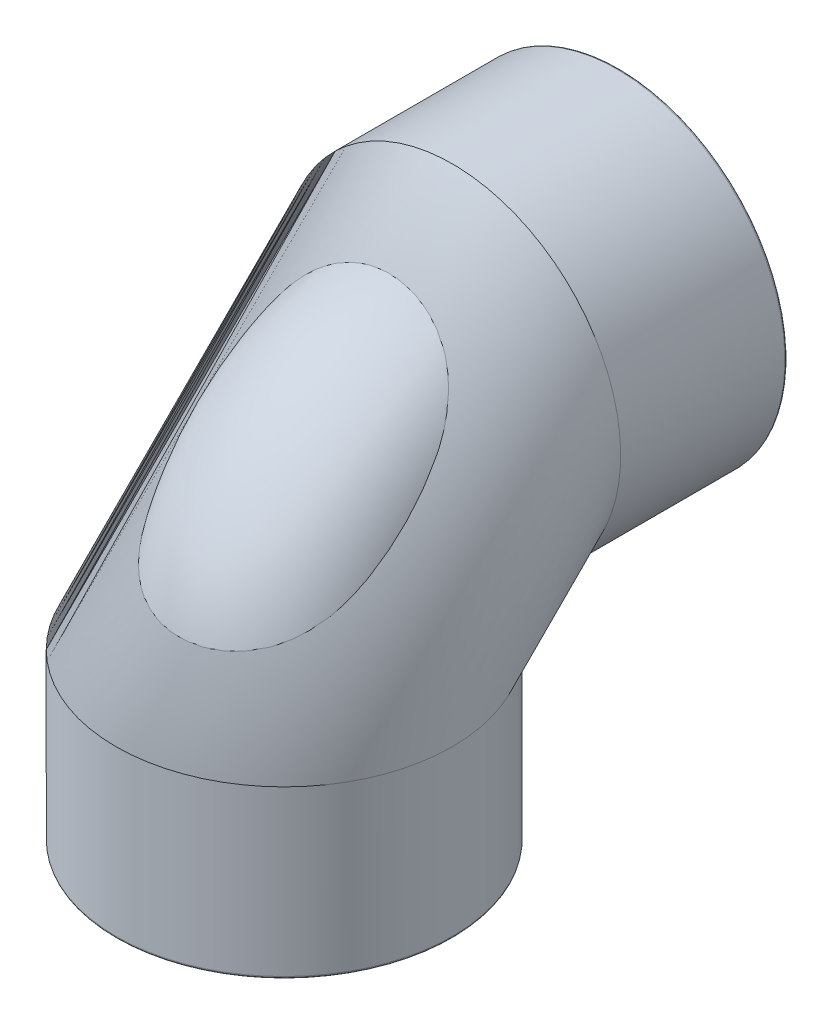
ISO-10303-21;
HEADER;
FILE_DESCRIPTION(('STEP AP214'),'2;1');
FILE_NAME('part.step','',(''),(''),'','','');
FILE_SCHEMA(('AUTOMOTIVE_DESIGN { 1 0 10303 214 1 1 1 1 }'));
ENDSEC;
DATA;
#1=APPLICATION_CONTEXT('core data for automotive mechanical design processes');
#2=APPLICATION_PROTOCOL_DEFINITION('international standard','automotive_design',2000,#1);
#3=PRODUCT_CONTEXT('',#1,'mechanical');
#4=PRODUCT('Part','Part','',(#3));
#5=PRODUCT_RELATED_PRODUCT_CATEGORY('part','',(#4));
#6=PRODUCT_DEFINITION_FORMATION('','',#4);
#7=PRODUCT_DEFINITION_CONTEXT('part definition',#1,'design');
#8=PRODUCT_DEFINITION('design','',#6,#7);
#9=PRODUCT_DEFINITION_SHAPE('','',#8);
#10=(LENGTH_UNIT() NAMED_UNIT(*) SI_UNIT(.MILLI.,.METRE.));
#11=(NAMED_UNIT(*) PLANE_ANGLE_UNIT() SI_UNIT($,.RADIAN.));
#12=(NAMED_UNIT(*) SI_UNIT($,.STERADIAN.) SOLID_ANGLE_UNIT());
#13=UNCERTAINTY_MEASURE_WITH_UNIT(LENGTH_MEASURE(1.E-05),#10,'distance_accuracy_value','');
#14=(GEOMETRIC_REPRESENTATION_CONTEXT(3) GLOBAL_UNCERTAINTY_ASSIGNED_CONTEXT((#13)) GLOBAL_UNIT_ASSIGNED_CONTEXT((#10,
#11,#12)) REPRESENTATION_CONTEXT('',''));
#15=CARTESIAN_POINT('',(0.,0.,0.));
#16=DIRECTION('',(0.,0.,1.));
#17=DIRECTION('',(1.,0.,0.));
#18=AXIS2_PLACEMENT_3D('',#15,#16,#17);
#19=CARTESIAN_POINT('',(0.,16.98625,-17.145));
#20=DIRECTION('',(-1.,0.,0.));
#21=DIRECTION('',(0.,0.,1.));
#22=AXIS2_PLACEMENT_3D('',#19,#20,#21);
#23=TOROIDAL_SURFACE('',#22,17.145,11.43);
#24=CARTESIAN_POINT('',(-7.45883023165069,24.9746838183603,-14.2875));
#25=CARTESIAN_POINT('',(-7.71480966111787,25.208812781819,-14.2875));
#26=CARTESIAN_POINT('',(-7.96089992627123,25.4537254122893,-14.2875));
#27=CARTESIAN_POINT('',(-8.43172250249195,25.9634593007728,-14.2875));
#28=CARTESIAN_POINT('',(-8.65644718191378,26.228287612492,-14.2875));
#29=CARTESIAN_POINT('',(-9.0830868593863,26.7763336796114,-14.2875));
#30=CARTESIAN_POINT('',(-9.28496867167002,27.0595772718441,-14.2875));
#31=CARTESIAN_POINT('',(-9.66397833373367,27.6421671954127,-14.2875));
#32=CARTESIAN_POINT('',(-9.84110666933505,27.9415132105563,-14.2875));
#33=CARTESIAN_POINT('',(-10.1687216120955,28.5534205121965,-14.2875));
#34=CARTESIAN_POINT('',(-10.3192781943923,28.8659443196865,-14.2875));
#35=CARTESIAN_POINT('',(-10.5930403915046,29.5027661150353,-14.2875));
#36=CARTESIAN_POINT('',(-10.7162453475049,29.8270643862854,-14.2875));
#37=CARTESIAN_POINT('',(-10.9341339115931,30.4849406084451,-14.2875));
#38=CARTESIAN_POINT('',(-11.0288309336531,30.8185141140679,-14.2875));
#39=CARTESIAN_POINT('',(-11.1888700450618,31.4926293715641,-14.2875));
#40=CARTESIAN_POINT('',(-11.2542128984137,31.8331709418377,-14.2875));
#41=CARTESIAN_POINT('',(-11.3536982676776,32.5107499884751,-14.2875));
#42=CARTESIAN_POINT('',(-11.3885261050358,32.8476869266677,-14.2875));
#43=CARTESIAN_POINT('',(-11.4290955630821,33.5233103918663,-14.2875));
#44=CARTESIAN_POINT('',(-11.4348375150483,33.8619968989014,-14.2875));
#45=CARTESIAN_POINT('',(-11.4170434075574,34.538597996359,-14.2875));
#46=CARTESIAN_POINT('',(-11.3935077643061,34.8765125976864,-14.2875));
#47=CARTESIAN_POINT('',(-11.3172016789524,35.5490255828601,-14.2875));
#48=CARTESIAN_POINT('',(-11.2644316962163,35.8836240187299,-14.2875));
#49=CARTESIAN_POINT('',(-11.1315370927082,36.5390774695893,-14.2875));
#50=CARTESIAN_POINT('',(-11.052091102539,36.8600702143011,-14.2875));
#51=CARTESIAN_POINT('',(-10.866088627293,37.4941022173594,-14.2875));
#52=CARTESIAN_POINT('',(-10.7595325690276,37.8071416008355,-14.2875));
#53=CARTESIAN_POINT('',(-10.5200168613575,38.4229230612669,-14.2875));
#54=CARTESIAN_POINT('',(-10.3870593554699,38.7256659718506,-14.2875));
#55=CARTESIAN_POINT('',(-10.095643538704,39.3186203313031,-14.2875));
#56=CARTESIAN_POINT('',(-9.93718542521087,39.6088318771479,-14.2875));
#57=CARTESIAN_POINT('',(-9.59851589753956,40.1701787613803,-14.2875));
#58=CARTESIAN_POINT('',(-9.41867749789791,40.4415392118104,-14.2875));
#59=CARTESIAN_POINT('',(-9.03661057550381,40.9680106499709,-14.2875));
#60=CARTESIAN_POINT('',(-8.83438229457443,41.2231218131558,-14.2875));
#61=CARTESIAN_POINT('',(-8.40896785057139,41.715209540656,-14.2875));
#62=CARTESIAN_POINT('',(-8.18578252882152,41.952186832266,-14.2875));
#63=CARTESIAN_POINT('',(-7.72003570034665,42.4062685474678,-14.2875));
#64=CARTESIAN_POINT('',(-7.47747427203375,42.6233730514742,-14.2875));
#65=CARTESIAN_POINT('',(-6.97701542710598,43.0342145211707,-14.2875));
#66=CARTESIAN_POINT('',(-6.71927836378393,43.2281468497279,-14.2875));
#67=CARTESIAN_POINT('',(-6.18831946313874,43.5935075203781,-14.2875));
#68=CARTESIAN_POINT('',(-5.91509772692646,43.764936009391,-14.2875));
#69=CARTESIAN_POINT('',(-5.35512309162894,44.0840333013399,-14.2875));
#70=CARTESIAN_POINT('',(-5.06837050233624,44.231702647907,-14.2875));
#71=CARTESIAN_POINT('',(-4.48338061663701,44.5022054368786,-14.2875));
#72=CARTESIAN_POINT('',(-4.18514334373327,44.6250389301051,-14.2875));
#73=CARTESIAN_POINT('',(-3.58086720981553,44.8444101236301,-14.2875));
#74=CARTESIAN_POINT('',(-3.27487572966313,44.9410783577361,-14.2875));
#75=CARTESIAN_POINT('',(-2.65582470105409,45.1082375774968,-14.2875));
#76=CARTESIAN_POINT('',(-2.3427651791848,45.1787286616029,-14.2875));
#77=CARTESIAN_POINT('',(-1.71181565375761,45.2930205453575,-14.2875));
#78=CARTESIAN_POINT('',(-1.39392571403858,45.3368216974267,-14.2875));
#79=CARTESIAN_POINT('',(-0.755582021134107,45.3974165510231,-14.2875));
#80=CARTESIAN_POINT('',(-0.435128269706446,45.4142102710654,-14.2875));
#81=CARTESIAN_POINT('',(0.205305613471225,45.4206606630631,-14.2875));
#82=CARTESIAN_POINT('',(0.525285111829833,45.4103803991724,-14.2875));
#83=CARTESIAN_POINT('',(1.16323902370062,45.3628910870351,-14.2875));
#84=CARTESIAN_POINT('',(1.48121344112481,45.3256820913442,-14.2875));
#85=CARTESIAN_POINT('',(2.11289456939969,45.2246050667367,-14.2875));
#86=CARTESIAN_POINT('',(2.4266013023133,45.1607371756943,-14.2875));
#87=CARTESIAN_POINT('',(3.04752019389867,45.006804624708,-14.2875));
#88=CARTESIAN_POINT('',(3.35473234948074,44.9167399523015,-14.2875));
#89=CARTESIAN_POINT('',(3.96043879778431,44.7110801504198,-14.2875));
#90=CARTESIAN_POINT('',(4.25893434515104,44.5954887159114,-14.2875));
#91=CARTESIAN_POINT('',(4.8451415701518,44.3396028927693,-14.2875));
#92=CARTESIAN_POINT('',(5.13285325453304,44.1993085195921,-14.2875));
#93=CARTESIAN_POINT('',(5.69546305621696,43.8950286448159,-14.2875));
#94=CARTESIAN_POINT('',(5.97036116964031,43.7310431360445,-14.2875));
#95=CARTESIAN_POINT('',(6.50541166137431,43.3805617106751,-14.2875));
#96=CARTESIAN_POINT('',(6.76556401444017,43.1940657555408,-14.2875));
#97=CARTESIAN_POINT('',(7.26980467173614,42.7995106793956,-14.2875));
#98=CARTESIAN_POINT('',(7.51385994712915,42.591409348299,-14.2875));
#99=CARTESIAN_POINT('',(7.98363411364638,42.1554496163827,-14.2875));
#100=CARTESIAN_POINT('',(8.20935299462803,41.9275912046348,-14.2875));
#101=CARTESIAN_POINT('',(8.64089216569168,41.4537501908955,-14.2875));
#102=CARTESIAN_POINT('',(8.84671229827925,41.2077674454808,-14.2875));
#103=CARTESIAN_POINT('',(9.23704002365344,40.6994377317327,-14.2875));
#104=CARTESIAN_POINT('',(9.42154754612238,40.4370907094122,-14.2875));
#105=CARTESIAN_POINT('',(9.76879472189519,39.8966627270961,-14.2875));
#106=CARTESIAN_POINT('',(9.9314306399601,39.618515113255,-14.2875));
#107=CARTESIAN_POINT('',(10.2328384588025,39.0495791869852,-14.2875));
#108=CARTESIAN_POINT('',(10.371610314724,38.7587908507976,-14.2875));
#109=CARTESIAN_POINT('',(10.6243805480562,38.1666374662274,-14.2875));
#110=CARTESIAN_POINT('',(10.7383786679564,37.8652723079418,-14.2875));
#111=CARTESIAN_POINT('',(10.9408777510648,37.2540953978092,-14.2875));
#112=CARTESIAN_POINT('',(11.0293785725126,36.944283599011,-14.2875));
#113=CARTESIAN_POINT('',(11.180976621597,36.3157984703174,-14.2875));
#114=CARTESIAN_POINT('',(11.243858106505,35.9970730998945,-14.2875));
#115=CARTESIAN_POINT('',(11.3428206700971,35.3554910254377,-14.2875));
#116=CARTESIAN_POINT('',(11.3789016476555,35.0326343058199,-14.2875));
#117=CARTESIAN_POINT('',(11.4241252207966,34.3850297839462,-14.2875));
#118=CARTESIAN_POINT('',(11.4332667644331,34.0602819083395,-14.2875));
#119=CARTESIAN_POINT('',(11.4246707102259,33.4111440236924,-14.2875));
#120=CARTESIAN_POINT('',(11.40693287151,33.086754017885,-14.2875));
#121=CARTESIAN_POINT('',(11.3444062385706,32.4360685386122,-14.2875));
#122=CARTESIAN_POINT('',(11.2992471638087,32.1098086408711,-14.2875));
#123=CARTESIAN_POINT('',(11.1820344918799,31.4621598701224,-14.2875));
#124=CARTESIAN_POINT('',(11.1099807053693,31.1407710314245,-14.2875));
#125=CARTESIAN_POINT('',(10.9396341650393,30.5050175096588,-14.2875));
#126=CARTESIAN_POINT('',(10.8413405968599,30.1906530449229,-14.2875));
#127=CARTESIAN_POINT('',(10.6193501172482,29.5710277493251,-14.2875));
#128=CARTESIAN_POINT('',(10.4956528588836,29.2657670428563,-14.2875));
#129=CARTESIAN_POINT('',(10.2209251226748,28.6598704078024,-14.2875));
#130=CARTESIAN_POINT('',(10.069364292786,28.3594749113808,-14.2875));
#131=CARTESIAN_POINT('',(9.74198110672175,27.7722118576001,-14.2875));
#132=CARTESIAN_POINT('',(9.56615841268171,27.4853444887049,-14.2875));
#133=CARTESIAN_POINT('',(9.19158540373032,26.9269875167978,-14.2875));
#134=CARTESIAN_POINT('',(8.99283469121879,26.6554981805818,-14.2875));
#135=CARTESIAN_POINT('',(8.573772191267,26.1295543740255,-14.2875));
#136=CARTESIAN_POINT('',(8.35345285930125,25.8751059172349,-14.2875));
#137=CARTESIAN_POINT('',(7.88690643538205,25.3787149724366,-14.2875));
#138=CARTESIAN_POINT('',(7.64015993023102,25.1372603763293,-14.2875));
#139=CARTESIAN_POINT('',(7.12729563067288,24.6758518668723,-14.2875));
#140=CARTESIAN_POINT('',(6.86117679188557,24.4558991142065,-14.2875));
#141=CARTESIAN_POINT('',(6.31109445603938,24.0391192676701,-14.2875));
#142=CARTESIAN_POINT('',(6.02711837504624,23.8423087688156,-14.2875));
#143=CARTESIAN_POINT('',(5.44327463720972,23.473880854259,-14.2875));
#144=CARTESIAN_POINT('',(5.1434081592971,23.3022615731368,-14.2875));
#145=CARTESIAN_POINT('',(4.53116499868975,22.9870539546967,-14.2875));
#146=CARTESIAN_POINT('',(4.21885884464122,22.8433289377235,-14.2875));
#147=CARTESIAN_POINT('',(3.5823485670853,22.5850844375329,-14.2875));
#148=CARTESIAN_POINT('',(3.25814436747691,22.4705651411552,-14.2875));
#149=CARTESIAN_POINT('',(2.60083180187842,22.273287871892,-14.2875));
#150=CARTESIAN_POINT('',(2.26774128877962,22.1904706940288,-14.2875));
#151=CARTESIAN_POINT('',(1.59496373357291,22.0585069937609,-14.2875));
#152=CARTESIAN_POINT('',(1.2552780212775,22.0093537546179,-14.2875));
#153=CARTESIAN_POINT('',(0.612058277614849,21.9498935650318,-14.2875));
#154=CARTESIAN_POINT('',(0.308874062033939,21.9357595908335,-14.2875));
#155=CARTESIAN_POINT('',(-0.297500318477271,21.9354140420423,-14.2875));
#156=CARTESIAN_POINT('',(-0.600690481448988,21.9492004805747,-14.2875));
#157=CARTESIAN_POINT('',(-1.20471078357848,22.0043345129748,-14.2875));
#158=CARTESIAN_POINT('',(-1.50553947275603,22.0456978759379,-14.2875));
#159=CARTESIAN_POINT('',(-2.1023162388687,22.1549548591278,-14.2875));
#160=CARTESIAN_POINT('',(-2.3982642809966,22.2228486684762,-14.2875));
#161=CARTESIAN_POINT('',(-2.9633598630968,22.3782386941022,-14.2875));
#162=CARTESIAN_POINT('',(-3.23296194945117,22.4640892417901,-14.2875));
#163=CARTESIAN_POINT('',(-3.76480148988058,22.656255414466,-14.2875));
#164=CARTESIAN_POINT('',(-4.02703602750168,22.7625790165032,-14.2875));
#165=CARTESIAN_POINT('',(-4.80021890461615,23.1100886422843,-14.2875));
#166=CARTESIAN_POINT('',(-5.29860454071473,23.3800833334385,-14.2875));
#167=CARTESIAN_POINT('',(-6.07394278603578,23.8736068720627,-14.2875));
#168=CARTESIAN_POINT('',(-6.36415390191336,24.0769073892622,-14.2875));
#169=CARTESIAN_POINT('',(-6.92595496038434,24.5079542240905,-14.2875));
#170=CARTESIAN_POINT('',(-7.19754430703957,24.7357013234666,-14.2875));
#171=CARTESIAN_POINT('',(-7.45883023165069,24.9746838183603,-14.2875));
#172=B_SPLINE_CURVE_WITH_KNOTS('',3,(#24,#25,#26,#27,#28,#29,#30,#31,#32,#33,#34,#35,#36,#37,
#38,#39,#40,#41,#42,#43,#44,#45,#46,#47,#48,#49,#50,#51,#52,#53,#54,#55,#56,#57,#58,#59,#60,#61,
#62,#63,#64,#65,#66,#67,#68,#69,#70,#71,#72,#73,#74,#75,#76,#77,#78,#79,#80,#81,#82,#83,#84,#85,
#86,#87,#88,#89,#90,#91,#92,#93,#94,#95,#96,#97,#98,#99,#100,#101,#102,#103,#104,#105,#106,#107,
#108,#109,#110,#111,#112,#113,#114,#115,#116,#117,#118,#119,#120,#121,#122,#123,#124,#125,#126,
#127,#128,#129,#130,#131,#132,#133,#134,#135,#136,#137,#138,#139,#140,#141,#142,#143,#144,#145,
#146,#147,#148,#149,#150,#151,#152,#153,#154,#155,#156,#157,#158,#159,#160,#161,#162,#163,#164,
#165,#166,#167,#168,#169,#170,#171),.UNSPECIFIED.,.T.,.F.,(4,2,2,2,2,2,2,2,2,2,2,2,2,2,2,2,2,2,
2,2,2,2,2,2,2,2,2,2,2,2,2,2,2,2,2,2,2,2,2,2,2,2,2,2,2,2,2,2,2,2,2,2,2,2,2,2,2,2,2,2,2,2,2,2,2,2,
2,2,2,2,2,2,2,4),(0.,1.04037090677345,2.08111204187129,3.12334624627011,4.16555999249695,
5.20498679133081,6.24443862399592,7.28340059127983,8.32233551585372,9.33729090422013,
10.352234732577,11.3671641328167,12.3820775856766,13.3729142944411,14.3637354047841,
15.3544761038454,16.34520913453,17.3206687422249,18.2961178154454,19.2715277458326,
20.2469337290873,21.2134285043718,22.1799169694252,23.1463833171891,24.1128476872363,
25.0743977467217,26.0359441898134,26.9974779361264,27.959011023255,28.918306367755,
29.8775998400412,30.8368883511205,31.7961773185575,32.7553275210265,33.7144771233678,
34.6736270160917,35.6327785508348,36.5938405443982,37.5549030695582,38.5159732007037,
39.4770465026611,40.4425284067939,41.4080121256678,42.3735058797731,43.3390050017446,
44.3124745048126,45.2859476810312,46.2594588694698,47.2329787818159,48.2199462931166,
49.206920752979,50.193925847467,51.1809444221458,52.1891779280415,53.1974254757614,
54.2056905103692,55.2143094965773,56.2487879738197,57.2833222621028,58.3185939351819,
59.353788907252,60.3837758202706,61.4137693223293,62.4418297751191,63.4696850461487,
64.3789727724272,65.2881957941688,66.1979391761814,67.1076890433891,67.955614920057,
68.8038718505885,70.4974288855687,71.559332882745,72.6212708473722),.UNSPECIFIED.);
#173=CARTESIAN_POINT('',(-7.45883023165069,24.9746838183603,-14.2875));
#174=VERTEX_POINT('',#173);
#175=EDGE_CURVE('E54',#174,#174,#172,.T.);
#176=ORIENTED_EDGE('',*,*,#175,.T.);
#177=EDGE_LOOP('',(#176));
#178=FACE_BOUND('',#177,.T.);
#179=CARTESIAN_POINT('',(-7.45883023165069,19.84375,-9.15656618163966));
#180=CARTESIAN_POINT('',(-7.20660308190654,19.84375,-9.38726726261968));
#181=CARTESIAN_POINT('',(-6.94481348450772,19.84375,-9.60746616004642));
#182=CARTESIAN_POINT('',(-6.40373502774383,19.84375,-10.0251952108714));
#183=CARTESIAN_POINT('',(-6.12444765973482,19.84375,-10.2227272921372));
#184=CARTESIAN_POINT('',(-5.54960174099671,19.84375,-10.5936311207526));
#185=CARTESIAN_POINT('',(-5.25401728364188,19.84375,-10.7669627573996));
#186=CARTESIAN_POINT('',(-4.64880803344292,19.84375,-11.0870898507218));
#187=CARTESIAN_POINT('',(-4.3391843729454,19.84375,-11.2338874427827));
#188=CARTESIAN_POINT('',(-3.71163060883385,19.84375,-11.497177911815));
#189=CARTESIAN_POINT('',(-3.39384431257995,19.84375,-11.6140125303389));
#190=CARTESIAN_POINT('',(-2.74873551396323,19.84375,-11.8173708301873));
#191=CARTESIAN_POINT('',(-2.4214148596278,19.84375,-11.9039003437041));
#192=CARTESIAN_POINT('',(-1.76047896103974,19.84375,-12.0443874483966));
#193=CARTESIAN_POINT('',(-1.42687708551208,19.84375,-12.0984075850342));
#194=CARTESIAN_POINT('',(-0.755939850581289,19.84375,-12.1724913765656));
#195=CARTESIAN_POINT('',(-0.4186051820495,19.84375,-12.1925612126288));
#196=CARTESIAN_POINT('',(0.212341610182404,19.84375,-12.1977421453179));
#197=CARTESIAN_POINT('',(0.505926832660595,19.84375,-12.1870653632411));
#198=CARTESIAN_POINT('',(1.09098662819055,19.84375,-12.1398317382762));
#199=CARTESIAN_POINT('',(1.38246135632624,19.84375,-12.1032768168758));
#200=CARTESIAN_POINT('',(1.96134334011347,19.84375,-12.0051283695919));
#201=CARTESIAN_POINT('',(2.24874767870264,19.84375,-11.9435177425575));
#202=CARTESIAN_POINT('',(2.81740502313489,19.84375,-11.7965386199918));
#203=CARTESIAN_POINT('',(3.0986577543397,19.84375,-11.7111690660698));
#204=CARTESIAN_POINT('',(3.64740480772538,19.84375,-11.5202139031194));
#205=CARTESIAN_POINT('',(3.91506496201979,19.84375,-11.415102911157));
#206=CARTESIAN_POINT('',(4.44165858285719,19.84375,-11.1848960366284));
#207=CARTESIAN_POINT('',(4.70059124048908,19.84375,-11.0597983077187));
#208=CARTESIAN_POINT('',(5.20857934597632,19.84375,-10.7908966872246));
#209=CARTESIAN_POINT('',(5.45763360424261,19.84375,-10.6470905515834));
#210=CARTESIAN_POINT('',(5.94474629842509,19.84375,-10.3419797193796));
#211=CARTESIAN_POINT('',(6.1828052260082,19.84375,-10.1806758063293));
#212=CARTESIAN_POINT('',(6.67865469476737,19.84375,-9.81847121059937));
#213=CARTESIAN_POINT('',(6.93469682085984,19.84375,-9.6151716350956));
#214=CARTESIAN_POINT('',(7.42981518599496,19.84375,-9.18887024309762));
#215=CARTESIAN_POINT('',(7.66889071443264,19.84375,-8.96586760226523));
#216=CARTESIAN_POINT('',(8.12874468932483,19.84375,-8.50153102307599));
#217=CARTESIAN_POINT('',(8.34951487920136,19.84375,-8.26018890578969));
#218=CARTESIAN_POINT('',(8.77115949312901,19.84375,-7.76085710418892));
#219=CARTESIAN_POINT('',(8.97204075061315,19.84375,-7.50287318832412));
#220=CARTESIAN_POINT('',(9.36424488449791,19.84375,-6.95556647337711));
#221=CARTESIAN_POINT('',(9.55424202745872,19.84375,-6.6652919466277));
#222=CARTESIAN_POINT('',(9.90892804756818,19.84375,-6.06965328994559));
#223=CARTESIAN_POINT('',(10.0736157268255,19.84375,-5.76428844669493));
#224=CARTESIAN_POINT('',(10.3763029379106,19.84375,-5.14059230820951));
#225=CARTESIAN_POINT('',(10.514302023044,19.84375,-4.82226079605593));
#226=CARTESIAN_POINT('',(10.7623914937115,19.84375,-4.17490388526738));
#227=CARTESIAN_POINT('',(10.8724825795368,19.84375,-3.84587875519951));
#228=CARTESIAN_POINT('',(11.0624709086837,19.84375,-3.18393577815606));
#229=CARTESIAN_POINT('',(11.1427486003441,19.84375,-2.85112713908841));
#230=CARTESIAN_POINT('',(11.2743596971687,19.84375,-2.17982904094062));
#231=CARTESIAN_POINT('',(11.3256931644925,19.84375,-1.84133959406195));
#232=CARTESIAN_POINT('',(11.3988518612568,19.84375,-1.16121697714407));
#233=CARTESIAN_POINT('',(11.4206800319393,19.84375,-0.819584123874811));
#234=CARTESIAN_POINT('',(11.4345094686465,19.84375,-0.13571495702455));
#235=CARTESIAN_POINT('',(11.4265113402576,19.84375,0.206521344163163));
#236=CARTESIAN_POINT('',(11.3812006776841,19.84375,0.880129531589685));
#237=CARTESIAN_POINT('',(11.344653519355,19.84375,1.21155305321911));
#238=CARTESIAN_POINT('',(11.2433277667585,19.84375,1.87005649665474));
#239=CARTESIAN_POINT('',(11.1785496314037,19.84375,2.19713648897871));
#240=CARTESIAN_POINT('',(11.0211393538442,19.84375,2.84449776285321));
#241=CARTESIAN_POINT('',(10.9285094593547,19.84375,3.16477959080244));
#242=CARTESIAN_POINT('',(10.7159885560293,19.84375,3.79616860437137));
#243=CARTESIAN_POINT('',(10.596097823616,19.84375,4.10727588298408));
#244=CARTESIAN_POINT('',(10.3323424597097,19.84375,4.71229755967639));
#245=CARTESIAN_POINT('',(10.1889635008495,19.84375,5.00642377363342));
#246=CARTESIAN_POINT('',(9.87770776246292,19.84375,5.58141436213997));
#247=CARTESIAN_POINT('',(9.70983129685865,19.84375,5.8622789065695));
#248=CARTESIAN_POINT('',(9.35075536901368,19.84375,6.4086618672727));
#249=CARTESIAN_POINT('',(9.1595570784366,19.84375,6.67418105349388));
#250=CARTESIAN_POINT('',(8.75518122954576,19.84375,7.1879202039111));
#251=CARTESIAN_POINT('',(8.54200378485645,19.84375,7.43614025752642));
#252=CARTESIAN_POINT('',(8.09770904881432,19.84375,7.91074824165602));
#253=CARTESIAN_POINT('',(7.86682040241366,19.84375,8.13735025485602));
#254=CARTESIAN_POINT('',(7.38667766112849,19.84375,8.5701805860516));
#255=CARTESIAN_POINT('',(7.13742371279035,19.84375,8.77640906658754));
#256=CARTESIAN_POINT('',(6.62232974871352,19.84375,9.16697701745817));
#257=CARTESIAN_POINT('',(6.35649021405081,19.84375,9.35131712222989));
#258=CARTESIAN_POINT('',(5.81011980846073,19.84375,9.6967618542569));
#259=CARTESIAN_POINT('',(5.52958897728405,19.84375,9.85786654437654));
#260=CARTESIAN_POINT('',(4.95770204385648,19.84375,10.1546952713913));
#261=CARTESIAN_POINT('',(4.66642734020888,19.84375,10.2905761575649));
#262=CARTESIAN_POINT('',(4.07343951279189,19.84375,10.537242810796));
#263=CARTESIAN_POINT('',(3.77172643789593,19.84375,10.6480286953325));
#264=CARTESIAN_POINT('',(3.16001995911656,19.84375,10.8436971595587));
#265=CARTESIAN_POINT('',(2.85002669260763,19.84375,10.9285801687065));
#266=CARTESIAN_POINT('',(2.22397201708038,19.84375,11.0718265228532));
#267=CARTESIAN_POINT('',(1.90791061515343,19.84375,11.1301898988416));
#268=CARTESIAN_POINT('',(1.27303009588531,19.84375,11.2198236057093));
#269=CARTESIAN_POINT('',(0.954223464077961,19.84375,11.2511823944247));
#270=CARTESIAN_POINT('',(0.315101815885419,19.84375,11.2869043465388));
#271=CARTESIAN_POINT('',(-0.00521319662211215,19.84375,11.2912675792982));
#272=CARTESIAN_POINT('',(-0.645067623312145,19.84375,11.2729669488014));
#273=CARTESIAN_POINT('',(-0.964607043424887,19.84375,11.2503032928514));
#274=CARTESIAN_POINT('',(-1.60063696977352,19.84375,11.1781135745314));
#275=CARTESIAN_POINT('',(-1.91712747590658,19.84375,11.1285875112555));
#276=CARTESIAN_POINT('',(-2.54450724149526,19.84375,11.0030919660687));
#277=CARTESIAN_POINT('',(-2.85540155335925,19.84375,10.927147739591));
#278=CARTESIAN_POINT('',(-3.46969237708403,19.84375,10.7493557514456));
#279=CARTESIAN_POINT('',(-3.77308889721671,19.84375,10.6475080183573));
#280=CARTESIAN_POINT('',(-4.37023495393172,19.84375,10.4186450357206));
#281=CARTESIAN_POINT('',(-4.6639845125253,19.84375,10.2916298436009));
#282=CARTESIAN_POINT('',(-5.23976238454825,19.84375,10.0133482399084));
#283=CARTESIAN_POINT('',(-5.52179068379302,19.84375,9.86208179898876));
#284=CARTESIAN_POINT('',(-6.07245478511876,19.84375,9.53620115569616));
#285=CARTESIAN_POINT('',(-6.34107490088816,19.84375,9.3615604476879));
#286=CARTESIAN_POINT('',(-6.86268811549884,19.84375,8.99032354230877));
#287=CARTESIAN_POINT('',(-7.11568121279181,19.84375,8.79372734276254));
#288=CARTESIAN_POINT('',(-7.60427288950588,19.84375,8.37999222714754));
#289=CARTESIAN_POINT('',(-7.83987138737174,19.84375,8.16285321477387));
#290=CARTESIAN_POINT('',(-8.29203669184313,19.84375,7.70959037598924));
#291=CARTESIAN_POINT('',(-8.50860344852593,19.84375,7.47346649978161));
#292=CARTESIAN_POINT('',(-8.9219348239697,19.84375,6.9830662431671));
#293=CARTESIAN_POINT('',(-9.11862762347145,19.84375,6.72872933078959));
#294=CARTESIAN_POINT('',(-9.48999696358645,19.84375,6.20446178920273));
#295=CARTESIAN_POINT('',(-9.66467347484476,19.84375,5.93453113920251));
#296=CARTESIAN_POINT('',(-9.99083249039252,19.84375,5.38099820281779));
#297=CARTESIAN_POINT('',(-10.1423145808863,19.84375,5.09739567264134));
#298=CARTESIAN_POINT('',(-10.4210775033825,19.84375,4.5185370464247));
#299=CARTESIAN_POINT('',(-10.5483582247057,19.84375,4.22328089709684));
#300=CARTESIAN_POINT('',(-10.7786661993678,19.84375,3.62118992502479));
#301=CARTESIAN_POINT('',(-10.8815254723387,19.84375,3.3142908472178));
#302=CARTESIAN_POINT('',(-11.0612427674378,19.84375,2.69297394451966));
#303=CARTESIAN_POINT('',(-11.1381007081021,19.84375,2.37855609607499));
#304=CARTESIAN_POINT('',(-11.2653682484632,19.84375,1.74442505110549));
#305=CARTESIAN_POINT('',(-11.3157786762174,19.84375,1.4247120206933));
#306=CARTESIAN_POINT('',(-11.3899097220825,19.84375,0.782208507979222));
#307=CARTESIAN_POINT('',(-11.4136301679671,19.84375,0.459418005832425));
#308=CARTESIAN_POINT('',(-11.4344508091782,19.84375,-0.190665569769944));
#309=CARTESIAN_POINT('',(-11.4312476996969,19.84375,-0.517968359835673));
#310=CARTESIAN_POINT('',(-11.3976532841509,19.84375,-1.17117370129803));
#311=CARTESIAN_POINT('',(-11.3672617219642,19.84375,-1.49707623947488));
#312=CARTESIAN_POINT('',(-11.2796312766137,19.84375,-2.14535736033465));
#313=CARTESIAN_POINT('',(-11.2223835644408,19.84375,-2.46773474842567));
#314=CARTESIAN_POINT('',(-11.081586079373,19.84375,-3.10668597390781));
#315=CARTESIAN_POINT('',(-10.9980364056702,19.84375,-3.4232598331809));
#316=CARTESIAN_POINT('',(-10.80354266094,19.84375,-4.05442173717319));
#317=CARTESIAN_POINT('',(-10.6921117800401,19.84375,-4.36885979883472));
#318=CARTESIAN_POINT('',(-10.4436429483795,19.84375,-4.98745281118695));
#319=CARTESIAN_POINT('',(-10.3066041961063,19.84375,-5.29160743965977));
#320=CARTESIAN_POINT('',(-10.0081748724772,19.84375,-5.8873353321306));
#321=CARTESIAN_POINT('',(-9.84680943040106,19.84375,-6.17892118445947));
#322=CARTESIAN_POINT('',(-9.50091767798939,19.84375,-6.74789111767724));
#323=CARTESIAN_POINT('',(-9.31639693328319,19.84375,-7.0252785888201));
#324=CARTESIAN_POINT('',(-8.87631300473694,19.84375,-7.6319880044023));
#325=CARTESIAN_POINT('',(-8.61455106519485,19.84375,-7.9568379019356));
#326=CARTESIAN_POINT('',(-8.05954281839716,19.84375,-8.57851898592453));
#327=CARTESIAN_POINT('',(-7.76629104867734,19.84375,-8.87534529436009));
#328=CARTESIAN_POINT('',(-7.45883023165069,19.84375,-9.15656618163966));
#329=B_SPLINE_CURVE_WITH_KNOTS('',3,(#179,#180,#181,#182,#183,#184,#185,#186,#187,#188,#189,
#190,#191,#192,#193,#194,#195,#196,#197,#198,#199,#200,#201,#202,#203,#204,#205,#206,#207,#208,
#209,#210,#211,#212,#213,#214,#215,#216,#217,#218,#219,#220,#221,#222,#223,#224,#225,#226,#227,
#228,#229,#230,#231,#232,#233,#234,#235,#236,#237,#238,#239,#240,#241,#242,#243,#244,#245,#246,
#247,#248,#249,#250,#251,#252,#253,#254,#255,#256,#257,#258,#259,#260,#261,#262,#263,#264,#265,
#266,#267,#268,#269,#270,#271,#272,#273,#274,#275,#276,#277,#278,#279,#280,#281,#282,#283,#284,
#285,#286,#287,#288,#289,#290,#291,#292,#293,#294,#295,#296,#297,#298,#299,#300,#301,#302,#303,
#304,#305,#306,#307,#308,#309,#310,#311,#312,#313,#314,#315,#316,#317,#318,#319,#320,#321,#322,
#323,#324,#325,#326,#327,#328),.UNSPECIFIED.,.T.,.F.,(4,2,2,2,2,2,2,2,2,2,2,2,2,2,2,2,2,2,2,2,2,
2,2,2,2,2,2,2,2,2,2,2,2,2,2,2,2,2,2,2,2,2,2,2,2,2,2,2,2,2,2,2,2,2,2,2,2,2,2,2,2,2,2,2,2,2,2,2,2,
2,2,2,2,2,4),(0.,1.02510832393552,2.05012939520224,3.07682970254535,4.10344734709476,
5.11777532830135,6.13190799552812,7.14408326195849,8.15607422661953,9.03627952616585,
9.91641947610496,10.797161154637,11.6779420739154,12.5397674068805,13.4016723999962,
14.2636808733301,15.1256507637249,16.1053976721946,17.0851855908094,18.06541306319,
19.0453025720201,20.0848269555343,21.1244005243675,22.1639914913293,23.2035563694115,
24.2293581490702,25.2551577257471,26.2808550378274,27.3065315245033,28.3056165099575,
29.304685255254,30.3036733945326,31.3026514046082,32.2831088435755,33.2635537196204,
34.2439493594321,35.224339931199,36.1937079480143,37.163068230572,38.1324004092503,
39.1017299653121,40.0648137339202,41.0278929938914,41.9909562855796,42.954018451878,
43.9139138221635,44.8738067261483,45.8336922674493,46.7935778411223,47.7525482866513,
48.7115176741541,49.6704848734468,50.6294532332092,51.5895183927887,52.5495836474912,
53.509653403211,54.4697256772432,55.4331518463078,56.3965792999224,57.3600239393809,
58.3234729848248,59.2933685465934,60.2632671470821,61.233135378753,62.2030098687988,
63.1838249084669,64.164649187752,65.1457961410435,66.1269393941987,67.1265817529704,
68.1262554052489,69.1249033900868,70.1233117971181,71.3726851910567,72.6222756619388),.UNSPECIFIED.);
#330=CARTESIAN_POINT('',(-7.45883023165069,19.84375,-9.15656618163966));
#331=VERTEX_POINT('',#330);
#332=EDGE_CURVE('E68',#331,#331,#329,.T.);
#333=ORIENTED_EDGE('',*,*,#332,.T.);
#334=EDGE_LOOP('',(#333));
#335=FACE_BOUND('',#334,.T.);
#336=ADVANCED_FACE('F37',(#178,#335),#23,.F.);
#337=CARTESIAN_POINT('',(0.,0.,0.));
#338=DIRECTION('',(0.,1.,0.));
#339=DIRECTION('',(0.,0.,1.));
#340=AXIS2_PLACEMENT_3D('',#337,#338,#339);
#341=CYLINDRICAL_SURFACE('',#340,17.145);
#342=CARTESIAN_POINT('',(0.,0.254,0.));
#343=DIRECTION('',(0.,1.,0.));
#344=DIRECTION('',(0.,0.,1.));
#345=AXIS2_PLACEMENT_3D('',#342,#343,#344);
#346=CIRCLE('',#345,17.145);
#347=CARTESIAN_POINT('',(0.,0.254,17.145));
#348=VERTEX_POINT('',#347);
#349=EDGE_CURVE('E44',#348,#348,#346,.T.);
#350=ORIENTED_EDGE('',*,*,#349,.T.);
#351=EDGE_LOOP('',(#350));
#352=FACE_BOUND('',#351,.T.);
#353=CARTESIAN_POINT('',(0.,16.98625,0.));
#354=DIRECTION('',(0.,1.,0.));
#355=DIRECTION('',(0.,0.,1.));
#356=AXIS2_PLACEMENT_3D('',#353,#354,#355);
#357=CIRCLE('',#356,17.145);
#358=CARTESIAN_POINT('',(0.,16.98625,-17.145));
#359=VERTEX_POINT('',#358);
#360=EDGE_CURVE('E48',#359,#359,#357,.T.);
#361=ORIENTED_EDGE('',*,*,#360,.F.);
#362=EDGE_LOOP('',(#361));
#363=FACE_BOUND('',#362,.T.);
#364=ADVANCED_FACE('F49',(#352,#363),#341,.T.);
#365=CARTESIAN_POINT('',(0.,16.98625,-17.145));
#366=DIRECTION('',(-1.,0.,0.));
#367=DIRECTION('',(0.,0.,1.));
#368=AXIS2_PLACEMENT_3D('',#365,#366,#367);
#369=DEGENERATE_TOROIDAL_SURFACE('',#368,17.145,17.145,.T.);
#370=CARTESIAN_POINT('',(0.,34.13125,-17.145));
#371=DIRECTION('',(0.,0.,-1.));
#372=DIRECTION('',(0.,1.,0.));
#373=AXIS2_PLACEMENT_3D('',#370,#371,#372);
#374=CIRCLE('',#373,17.145);
#375=EDGE_CURVE('E53',#359,#359,#374,.T.);
#376=ORIENTED_EDGE('',*,*,#375,.F.);
#377=ORIENTED_EDGE('',*,*,#360,.T.);
#378=EDGE_LOOP('',(#376,#377));
#379=FACE_BOUND('',#378,.T.);
#380=ADVANCED_FACE('F94',(#379),#369,.T.);
#381=CARTESIAN_POINT('',(0.,34.13125,-17.145));
#382=DIRECTION('',(0.,0.,-1.));
#383=DIRECTION('',(-1.,0.,0.));
#384=AXIS2_PLACEMENT_3D('',#381,#382,#383);
#385=CYLINDRICAL_SURFACE('',#384,17.145);
#386=CARTESIAN_POINT('',(0.,34.13125,-33.87725));
#387=DIRECTION('',(0.,0.,-1.));
#388=DIRECTION('',(-1.,0.,0.));
#389=AXIS2_PLACEMENT_3D('',#386,#387,#388);
#390=CIRCLE('',#389,17.145);
#391=CARTESIAN_POINT('',(-17.145,34.13125,-33.87725));
#392=VERTEX_POINT('',#391);
#393=EDGE_CURVE('E11',#392,#392,#390,.F.);
#394=ORIENTED_EDGE('',*,*,#393,.T.);
#395=EDGE_LOOP('',(#394));
#396=FACE_BOUND('',#395,.T.);
#397=ORIENTED_EDGE('',*,*,#375,.T.);
#398=EDGE_LOOP('',(#397));
#399=FACE_BOUND('',#398,.T.);
#400=ADVANCED_FACE('F155',(#396,#399),#385,.T.);
#401=CARTESIAN_POINT('',(0.,0.,0.));
#402=DIRECTION('',(0.,1.,0.));
#403=DIRECTION('',(0.,0.,1.));
#404=AXIS2_PLACEMENT_3D('',#401,#402,#403);
#405=PLANE('',#404);
#406=CARTESIAN_POINT('',(0.,0.,0.));
#407=DIRECTION('',(0.,1.,0.));
#408=DIRECTION('',(0.,0.,1.));
#409=AXIS2_PLACEMENT_3D('',#406,#407,#408);
#410=CIRCLE('',#409,13.6906);
#411=CARTESIAN_POINT('',(0.,0.,13.6906));
#412=VERTEX_POINT('',#411);
#413=EDGE_CURVE('E124',#412,#412,#410,.T.);
#414=ORIENTED_EDGE('',*,*,#413,.T.);
#415=EDGE_LOOP('',(#414));
#416=FACE_BOUND('',#415,.T.);
#417=CARTESIAN_POINT('',(0.,0.,0.));
#418=DIRECTION('',(0.,1.,0.));
#419=DIRECTION('',(0.,0.,1.));
#420=AXIS2_PLACEMENT_3D('',#417,#418,#419);
#421=CIRCLE('',#420,16.891);
#422=CARTESIAN_POINT('',(0.,0.,16.891));
#423=VERTEX_POINT('',#422);
#424=EDGE_CURVE('E122',#423,#423,#421,.F.);
#425=ORIENTED_EDGE('',*,*,#424,.T.);
#426=EDGE_LOOP('',(#425));
#427=FACE_BOUND('',#426,.T.);
#428=ADVANCED_FACE('F89',(#416,#427),#405,.F.);
#429=CARTESIAN_POINT('',(0.,34.13125,-34.13125));
#430=DIRECTION('',(0.,0.,-1.));
#431=DIRECTION('',(0.,1.,0.));
#432=AXIS2_PLACEMENT_3D('',#429,#430,#431);
#433=PLANE('',#432);
#434=CARTESIAN_POINT('',(0.,34.13125,-34.13125));
#435=DIRECTION('',(0.,0.,-1.));
#436=DIRECTION('',(-1.,0.,0.));
#437=AXIS2_PLACEMENT_3D('',#434,#435,#436);
#438=CIRCLE('',#437,13.6906);
#439=CARTESIAN_POINT('',(-13.6906,34.13125,-34.13125));
#440=VERTEX_POINT('',#439);
#441=EDGE_CURVE('E134',#440,#440,#438,.F.);
#442=ORIENTED_EDGE('',*,*,#441,.T.);
#443=EDGE_LOOP('',(#442));
#444=FACE_BOUND('',#443,.T.);
#445=CARTESIAN_POINT('',(0.,34.13125,-34.13125));
#446=DIRECTION('',(0.,0.,-1.));
#447=DIRECTION('',(-1.,0.,0.));
#448=AXIS2_PLACEMENT_3D('',#445,#446,#447);
#449=CIRCLE('',#448,16.891);
#450=CARTESIAN_POINT('',(-16.891,34.13125,-34.13125));
#451=VERTEX_POINT('',#450);
#452=EDGE_CURVE('E131',#451,#451,#449,.T.);
#453=ORIENTED_EDGE('',*,*,#452,.T.);
#454=EDGE_LOOP('',(#453));
#455=FACE_BOUND('',#454,.T.);
#456=ADVANCED_FACE('F84',(#444,#455),#433,.T.);
#457=CARTESIAN_POINT('',(0.,34.13125,-14.2875));
#458=DIRECTION('',(0.,0.,-1.));
#459=DIRECTION('',(-1.,0.,0.));
#460=AXIS2_PLACEMENT_3D('',#457,#458,#459);
#461=CYLINDRICAL_SURFACE('',#460,13.4366);
#462=CARTESIAN_POINT('',(0.,34.13125,-33.87725));
#463=DIRECTION('',(0.,0.,-1.));
#464=DIRECTION('',(-1.,0.,0.));
#465=AXIS2_PLACEMENT_3D('',#462,#463,#464);
#466=CIRCLE('',#465,13.4366);
#467=CARTESIAN_POINT('',(-13.4366,34.13125,-33.87725));
#468=VERTEX_POINT('',#467);
#469=EDGE_CURVE('E129',#468,#468,#466,.T.);
#470=CARTESIAN_POINT('',(0.,34.13125,-14.2875));
#471=DIRECTION('',(0.,0.,-1.));
#472=DIRECTION('',(-1.,0.,0.));
#473=AXIS2_PLACEMENT_3D('',#470,#471,#472);
#474=CIRCLE('',#473,13.4366);
#475=CARTESIAN_POINT('',(-13.4366,34.13125,-14.2875));
#476=VERTEX_POINT('',#475);
#477=EDGE_CURVE('E59',#476,#476,#474,.T.);
#478=CARTESIAN_POINT('',(-13.4366,34.13125,-33.87725));
#479=CARTESIAN_POINT('',(-13.4366,34.13125,-33.6731901041667));
#480=CARTESIAN_POINT('',(-13.4366,34.13125,-33.4691302083333));
#481=CARTESIAN_POINT('',(-13.4366,34.13125,-33.0610104166667));
#482=CARTESIAN_POINT('',(-13.4366,34.13125,-32.8569505208333));
#483=CARTESIAN_POINT('',(-13.4366,34.13125,-32.4488307291667));
#484=CARTESIAN_POINT('',(-13.4366,34.13125,-32.2447708333333));
#485=CARTESIAN_POINT('',(-13.4366,34.13125,-31.8366510416667));
#486=CARTESIAN_POINT('',(-13.4366,34.13125,-31.6325911458333));
#487=CARTESIAN_POINT('',(-13.4366,34.13125,-31.2244713541667));
#488=CARTESIAN_POINT('',(-13.4366,34.13125,-31.0204114583333));
#489=CARTESIAN_POINT('',(-13.4366,34.13125,-30.6122916666667));
#490=CARTESIAN_POINT('',(-13.4366,34.13125,-30.4082317708333));
#491=CARTESIAN_POINT('',(-13.4366,34.13125,-30.0001119791667));
#492=CARTESIAN_POINT('',(-13.4366,34.13125,-29.7960520833333));
#493=CARTESIAN_POINT('',(-13.4366,34.13125,-29.3879322916667));
#494=CARTESIAN_POINT('',(-13.4366,34.13125,-29.1838723958333));
#495=CARTESIAN_POINT('',(-13.4366,34.13125,-28.7757526041667));
#496=CARTESIAN_POINT('',(-13.4366,34.13125,-28.5716927083333));
#497=CARTESIAN_POINT('',(-13.4366,34.13125,-28.1635729166667));
#498=CARTESIAN_POINT('',(-13.4366,34.13125,-27.9595130208333));
#499=CARTESIAN_POINT('',(-13.4366,34.13125,-27.5513932291667));
#500=CARTESIAN_POINT('',(-13.4366,34.13125,-27.3473333333333));
#501=CARTESIAN_POINT('',(-13.4366,34.13125,-26.9392135416667));
#502=CARTESIAN_POINT('',(-13.4366,34.13125,-26.7351536458333));
#503=CARTESIAN_POINT('',(-13.4366,34.13125,-26.3270338541667));
#504=CARTESIAN_POINT('',(-13.4366,34.13125,-26.1229739583333));
#505=CARTESIAN_POINT('',(-13.4366,34.13125,-25.7148541666667));
#506=CARTESIAN_POINT('',(-13.4366,34.13125,-25.5107942708333));
#507=CARTESIAN_POINT('',(-13.4366,34.13125,-25.1026744791667));
#508=CARTESIAN_POINT('',(-13.4366,34.13125,-24.8986145833333));
#509=CARTESIAN_POINT('',(-13.4366,34.13125,-24.4904947916667));
#510=CARTESIAN_POINT('',(-13.4366,34.13125,-24.2864348958333));
#511=CARTESIAN_POINT('',(-13.4366,34.13125,-23.8783151041667));
#512=CARTESIAN_POINT('',(-13.4366,34.13125,-23.6742552083333));
#513=CARTESIAN_POINT('',(-13.4366,34.13125,-23.2661354166667));
#514=CARTESIAN_POINT('',(-13.4366,34.13125,-23.0620755208333));
#515=CARTESIAN_POINT('',(-13.4366,34.13125,-22.6539557291667));
#516=CARTESIAN_POINT('',(-13.4366,34.13125,-22.4498958333333));
#517=CARTESIAN_POINT('',(-13.4366,34.13125,-22.0417760416667));
#518=CARTESIAN_POINT('',(-13.4366,34.13125,-21.8377161458333));
#519=CARTESIAN_POINT('',(-13.4366,34.13125,-21.4295963541667));
#520=CARTESIAN_POINT('',(-13.4366,34.13125,-21.2255364583333));
#521=CARTESIAN_POINT('',(-13.4366,34.13125,-20.8174166666667));
#522=CARTESIAN_POINT('',(-13.4366,34.13125,-20.6133567708333));
#523=CARTESIAN_POINT('',(-13.4366,34.13125,-20.2052369791667));
#524=CARTESIAN_POINT('',(-13.4366,34.13125,-20.0011770833333));
#525=CARTESIAN_POINT('',(-13.4366,34.13125,-19.5930572916667));
#526=CARTESIAN_POINT('',(-13.4366,34.13125,-19.3889973958333));
#527=CARTESIAN_POINT('',(-13.4366,34.13125,-18.9808776041667));
#528=CARTESIAN_POINT('',(-13.4366,34.13125,-18.7768177083333));
#529=CARTESIAN_POINT('',(-13.4366,34.13125,-18.3686979166667));
#530=CARTESIAN_POINT('',(-13.4366,34.13125,-18.1646380208333));
#531=CARTESIAN_POINT('',(-13.4366,34.13125,-17.7565182291667));
#532=CARTESIAN_POINT('',(-13.4366,34.13125,-17.5524583333333));
#533=CARTESIAN_POINT('',(-13.4366,34.13125,-17.1443385416667));
#534=CARTESIAN_POINT('',(-13.4366,34.13125,-16.9402786458333));
#535=CARTESIAN_POINT('',(-13.4366,34.13125,-16.5321588541667));
#536=CARTESIAN_POINT('',(-13.4366,34.13125,-16.3280989583333));
#537=CARTESIAN_POINT('',(-13.4366,34.13125,-15.9199791666667));
#538=CARTESIAN_POINT('',(-13.4366,34.13125,-15.7159192708333));
#539=CARTESIAN_POINT('',(-13.4366,34.13125,-15.3077994791667));
#540=CARTESIAN_POINT('',(-13.4366,34.13125,-15.1037395833333));
#541=CARTESIAN_POINT('',(-13.4366,34.13125,-14.6956197916667));
#542=CARTESIAN_POINT('',(-13.4366,34.13125,-14.4915598958333));
#543=CARTESIAN_POINT('',(-13.4366,34.13125,-14.2875));
#544=B_SPLINE_CURVE_WITH_KNOTS('',3,(#478,#479,#480,#481,#482,#483,#484,#485,#486,#487,#488,
#489,#490,#491,#492,#493,#494,#495,#496,#497,#498,#499,#500,#501,#502,#503,#504,#505,#506,#507,
#508,#509,#510,#511,#512,#513,#514,#515,#516,#517,#518,#519,#520,#521,#522,#523,#524,#525,#526,
#527,#528,#529,#530,#531,#532,#533,#534,#535,#536,#537,#538,#539,#540,#541,#542,#543),
.UNSPECIFIED.,.F.,.F.,(4,2,2,2,2,2,2,2,2,2,2,2,2,2,2,2,2,2,2,2,2,2,2,2,2,2,2,2,2,2,2,2,4),(0.,
0.612179687499992,1.224359375,1.8365390625,2.44871874999999,3.0608984375,3.673078125,
4.28525781249999,4.8974375,5.5096171875,6.12179687499999,6.73397656249999,7.34615625,
7.9583359375,8.570515625,9.1826953125,9.79487499999999,10.4070546875,11.019234375,11.6314140625,
12.24359375,12.8557734375,13.467953125,14.0801328125,14.6923125,15.3044921875,15.916671875,
16.5288515625,17.14103125,17.7532109375,18.365390625,18.9775703125,19.58975),.UNSPECIFIED.);
#545=EDGE_CURVE('BSEAM81',#468,#476,#544,.T.);
#546=ORIENTED_EDGE('',*,*,#469,.T.);
#547=ORIENTED_EDGE('',*,*,#477,.F.);
#548=ORIENTED_EDGE('',*,*,#545,.T.);
#549=ORIENTED_EDGE('',*,*,#545,.F.);
#550=EDGE_LOOP('',(#546,#548,#547,#549));
#551=FACE_BOUND('',#550,.T.);
#552=ADVANCED_FACE('F81',(#551),#461,.F.);
#553=CARTESIAN_POINT('',(0.,34.13125,-14.2875));
#554=DIRECTION('',(0.,0.,-1.));
#555=DIRECTION('',(-1.,0.,0.));
#556=AXIS2_PLACEMENT_3D('',#553,#554,#555);
#557=PLANE('',#556);
#558=ORIENTED_EDGE('',*,*,#175,.F.);
#559=EDGE_LOOP('',(#558));
#560=FACE_BOUND('',#559,.T.);
#561=ORIENTED_EDGE('',*,*,#477,.T.);
#562=EDGE_LOOP('',(#561));
#563=FACE_BOUND('',#562,.T.);
#564=ADVANCED_FACE('F76',(#560,#563),#557,.T.);
#565=CARTESIAN_POINT('',(0.,19.84375,0.));
#566=DIRECTION('',(0.,-1.,0.));
#567=DIRECTION('',(0.,0.,-1.));
#568=AXIS2_PLACEMENT_3D('',#565,#566,#567);
#569=CYLINDRICAL_SURFACE('',#568,13.4366);
#570=CARTESIAN_POINT('',(0.,0.254000000000001,0.));
#571=DIRECTION('',(0.,1.,0.));
#572=DIRECTION('',(0.,0.,1.));
#573=AXIS2_PLACEMENT_3D('',#570,#571,#572);
#574=CIRCLE('',#573,13.4366);
#575=CARTESIAN_POINT('',(0.,0.254000000000001,-13.4366));
#576=VERTEX_POINT('',#575);
#577=EDGE_CURVE('E56',#576,#576,#574,.F.);
#578=CARTESIAN_POINT('',(0.,19.84375,0.));
#579=DIRECTION('',(0.,-1.,0.));
#580=DIRECTION('',(0.,0.,-1.));
#581=AXIS2_PLACEMENT_3D('',#578,#579,#580);
#582=CIRCLE('',#581,13.4366);
#583=CARTESIAN_POINT('',(0.,19.84375,-13.4366));
#584=VERTEX_POINT('',#583);
#585=EDGE_CURVE('E106',#584,#584,#582,.T.);
#586=CARTESIAN_POINT('',(0.,0.254000000000001,-13.4366));
#587=CARTESIAN_POINT('',(0.,0.458059895833334,-13.4366));
#588=CARTESIAN_POINT('',(0.,0.662119791666667,-13.4366));
#589=CARTESIAN_POINT('',(0.,1.07023958333333,-13.4366));
#590=CARTESIAN_POINT('',(0.,1.27429947916667,-13.4366));
#591=CARTESIAN_POINT('',(0.,1.68241927083333,-13.4366));
#592=CARTESIAN_POINT('',(0.,1.88647916666667,-13.4366));
#593=CARTESIAN_POINT('',(0.,2.29459895833333,-13.4366));
#594=CARTESIAN_POINT('',(0.,2.49865885416667,-13.4366));
#595=CARTESIAN_POINT('',(0.,2.90677864583334,-13.4366));
#596=CARTESIAN_POINT('',(0.,3.11083854166667,-13.4366));
#597=CARTESIAN_POINT('',(0.,3.51895833333333,-13.4366));
#598=CARTESIAN_POINT('',(0.,3.72301822916667,-13.4366));
#599=CARTESIAN_POINT('',(0.,4.13113802083333,-13.4366));
#600=CARTESIAN_POINT('',(0.,4.33519791666667,-13.4366));
#601=CARTESIAN_POINT('',(0.,4.74331770833333,-13.4366));
#602=CARTESIAN_POINT('',(0.,4.94737760416667,-13.4366));
#603=CARTESIAN_POINT('',(0.,5.35549739583333,-13.4366));
#604=CARTESIAN_POINT('',(0.,5.55955729166667,-13.4366));
#605=CARTESIAN_POINT('',(0.,5.96767708333333,-13.4366));
#606=CARTESIAN_POINT('',(0.,6.17173697916667,-13.4366));
#607=CARTESIAN_POINT('',(0.,6.57985677083333,-13.4366));
#608=CARTESIAN_POINT('',(0.,6.78391666666667,-13.4366));
#609=CARTESIAN_POINT('',(0.,7.19203645833333,-13.4366));
#610=CARTESIAN_POINT('',(0.,7.39609635416667,-13.4366));
#611=CARTESIAN_POINT('',(0.,7.80421614583333,-13.4366));
#612=CARTESIAN_POINT('',(0.,8.00827604166667,-13.4366));
#613=CARTESIAN_POINT('',(0.,8.41639583333333,-13.4366));
#614=CARTESIAN_POINT('',(0.,8.62045572916667,-13.4366));
#615=CARTESIAN_POINT('',(0.,9.02857552083333,-13.4366));
#616=CARTESIAN_POINT('',(0.,9.23263541666667,-13.4366));
#617=CARTESIAN_POINT('',(0.,9.64075520833333,-13.4366));
#618=CARTESIAN_POINT('',(0.,9.84481510416667,-13.4366));
#619=CARTESIAN_POINT('',(0.,10.2529348958333,-13.4366));
#620=CARTESIAN_POINT('',(0.,10.4569947916667,-13.4366));
#621=CARTESIAN_POINT('',(0.,10.8651145833333,-13.4366));
#622=CARTESIAN_POINT('',(0.,11.0691744791667,-13.4366));
#623=CARTESIAN_POINT('',(0.,11.4772942708333,-13.4366));
#624=CARTESIAN_POINT('',(0.,11.6813541666667,-13.4366));
#625=CARTESIAN_POINT('',(0.,12.0894739583333,-13.4366));
#626=CARTESIAN_POINT('',(0.,12.2935338541667,-13.4366));
#627=CARTESIAN_POINT('',(0.,12.7016536458333,-13.4366));
#628=CARTESIAN_POINT('',(0.,12.9057135416667,-13.4366));
#629=CARTESIAN_POINT('',(0.,13.3138333333333,-13.4366));
#630=CARTESIAN_POINT('',(0.,13.5178932291667,-13.4366));
#631=CARTESIAN_POINT('',(0.,13.9260130208333,-13.4366));
#632=CARTESIAN_POINT('',(0.,14.1300729166667,-13.4366));
#633=CARTESIAN_POINT('',(0.,14.5381927083333,-13.4366));
#634=CARTESIAN_POINT('',(0.,14.7422526041667,-13.4366));
#635=CARTESIAN_POINT('',(0.,15.1503723958333,-13.4366));
#636=CARTESIAN_POINT('',(0.,15.3544322916667,-13.4366));
#637=CARTESIAN_POINT('',(0.,15.7625520833333,-13.4366));
#638=CARTESIAN_POINT('',(0.,15.9666119791667,-13.4366));
#639=CARTESIAN_POINT('',(0.,16.3747317708333,-13.4366));
#640=CARTESIAN_POINT('',(0.,16.5787916666667,-13.4366));
#641=CARTESIAN_POINT('',(0.,16.9869114583333,-13.4366));
#642=CARTESIAN_POINT('',(0.,17.1909713541667,-13.4366));
#643=CARTESIAN_POINT('',(0.,17.5990911458333,-13.4366));
#644=CARTESIAN_POINT('',(0.,17.8031510416667,-13.4366));
#645=CARTESIAN_POINT('',(0.,18.2112708333333,-13.4366));
#646=CARTESIAN_POINT('',(0.,18.4153307291667,-13.4366));
#647=CARTESIAN_POINT('',(0.,18.8234505208333,-13.4366));
#648=CARTESIAN_POINT('',(0.,19.0275104166667,-13.4366));
#649=CARTESIAN_POINT('',(0.,19.4356302083333,-13.4366));
#650=CARTESIAN_POINT('',(0.,19.6396901041667,-13.4366));
#651=CARTESIAN_POINT('',(0.,19.84375,-13.4366));
#652=B_SPLINE_CURVE_WITH_KNOTS('',3,(#586,#587,#588,#589,#590,#591,#592,#593,#594,#595,#596,
#597,#598,#599,#600,#601,#602,#603,#604,#605,#606,#607,#608,#609,#610,#611,#612,#613,#614,#615,
#616,#617,#618,#619,#620,#621,#622,#623,#624,#625,#626,#627,#628,#629,#630,#631,#632,#633,#634,
#635,#636,#637,#638,#639,#640,#641,#642,#643,#644,#645,#646,#647,#648,#649,#650,#651),
.UNSPECIFIED.,.F.,.F.,(4,2,2,2,2,2,2,2,2,2,2,2,2,2,2,2,2,2,2,2,2,2,2,2,2,2,2,2,2,2,2,2,4),(0.,
0.612179687499999,1.224359375,1.8365390625,2.44871875,3.0608984375,3.673078125,4.2852578125,
4.8974375,5.5096171875,6.121796875,6.7339765625,7.34615625,7.9583359375,8.570515625,
9.1826953125,9.794875,10.4070546875,11.019234375,11.6314140625,12.24359375,12.8557734375,
13.467953125,14.0801328125,14.6923125,15.3044921875,15.916671875,16.5288515625,17.14103125,
17.7532109375,18.365390625,18.9775703125,19.58975),.UNSPECIFIED.);
#653=EDGE_CURVE('BSEAM80',#576,#584,#652,.T.);
#654=ORIENTED_EDGE('',*,*,#577,.T.);
#655=ORIENTED_EDGE('',*,*,#585,.F.);
#656=ORIENTED_EDGE('',*,*,#653,.T.);
#657=ORIENTED_EDGE('',*,*,#653,.F.);
#658=EDGE_LOOP('',(#654,#656,#655,#657));
#659=FACE_BOUND('',#658,.T.);
#660=ADVANCED_FACE('F80',(#659),#569,.F.);
#661=CARTESIAN_POINT('',(0.,19.84375,0.));
#662=DIRECTION('',(0.,-1.,0.));
#663=DIRECTION('',(0.,0.,-1.));
#664=AXIS2_PLACEMENT_3D('',#661,#662,#663);
#665=PLANE('',#664);
#666=ORIENTED_EDGE('',*,*,#332,.F.);
#667=EDGE_LOOP('',(#666));
#668=FACE_BOUND('',#667,.T.);
#669=ORIENTED_EDGE('',*,*,#585,.T.);
#670=EDGE_LOOP('',(#669));
#671=FACE_BOUND('',#670,.T.);
#672=ADVANCED_FACE('F111',(#668,#671),#665,.T.);
#673=CARTESIAN_POINT('',(0.,0.254000000000001,0.));
#674=DIRECTION('',(0.,1.,0.));
#675=DIRECTION('',(0.,0.,1.));
#676=AXIS2_PLACEMENT_3D('',#673,#674,#675);
#677=TOROIDAL_SURFACE('',#676,13.6906,0.254);
#678=ORIENTED_EDGE('',*,*,#413,.F.);
#679=EDGE_LOOP('',(#678));
#680=FACE_BOUND('',#679,.T.);
#681=ORIENTED_EDGE('',*,*,#577,.F.);
#682=EDGE_LOOP('',(#681));
#683=FACE_BOUND('',#682,.T.);
#684=ADVANCED_FACE('F118',(#680,#683),#677,.T.);
#685=CARTESIAN_POINT('',(0.,34.13125,-33.87725));
#686=DIRECTION('',(0.,0.,-1.));
#687=DIRECTION('',(-1.,0.,0.));
#688=AXIS2_PLACEMENT_3D('',#685,#686,#687);
#689=TOROIDAL_SURFACE('',#688,13.6906,0.254);
#690=ORIENTED_EDGE('',*,*,#441,.F.);
#691=EDGE_LOOP('',(#690));
#692=FACE_BOUND('',#691,.T.);
#693=ORIENTED_EDGE('',*,*,#469,.F.);
#694=EDGE_LOOP('',(#693));
#695=FACE_BOUND('',#694,.T.);
#696=ADVANCED_FACE('F141',(#692,#695),#689,.T.);
#697=CARTESIAN_POINT('',(0.,0.254,0.));
#698=DIRECTION('',(0.,1.,0.));
#699=DIRECTION('',(0.,0.,1.));
#700=AXIS2_PLACEMENT_3D('',#697,#698,#699);
#701=TOROIDAL_SURFACE('',#700,16.891,0.254);
#702=ORIENTED_EDGE('',*,*,#424,.F.);
#703=EDGE_LOOP('',(#702));
#704=FACE_BOUND('',#703,.T.);
#705=ORIENTED_EDGE('',*,*,#349,.F.);
#706=EDGE_LOOP('',(#705));
#707=FACE_BOUND('',#706,.T.);
#708=ADVANCED_FACE('F139',(#704,#707),#701,.T.);
#709=CARTESIAN_POINT('',(0.,34.13125,-33.87725));
#710=DIRECTION('',(0.,0.,-1.));
#711=DIRECTION('',(-1.,0.,0.));
#712=AXIS2_PLACEMENT_3D('',#709,#710,#711);
#713=TOROIDAL_SURFACE('',#712,16.891,0.254);
#714=ORIENTED_EDGE('',*,*,#393,.F.);
#715=EDGE_LOOP('',(#714));
#716=FACE_BOUND('',#715,.T.);
#717=ORIENTED_EDGE('',*,*,#452,.F.);
#718=EDGE_LOOP('',(#717));
#719=FACE_BOUND('',#718,.T.);
#720=ADVANCED_FACE('F39',(#716,#719),#713,.T.);
#721=CLOSED_SHELL('',(#336,#364,#380,#400,#428,#456,#552,#564,#660,#672,#684,#696,#708,#720));
#722=MANIFOLD_SOLID_BREP('B2',#721);
#723=ADVANCED_BREP_SHAPE_REPRESENTATION('',(#18,#722),#14);
#724=SHAPE_DEFINITION_REPRESENTATION(#9,#723);
ENDSEC;
END-ISO-10303-21;
